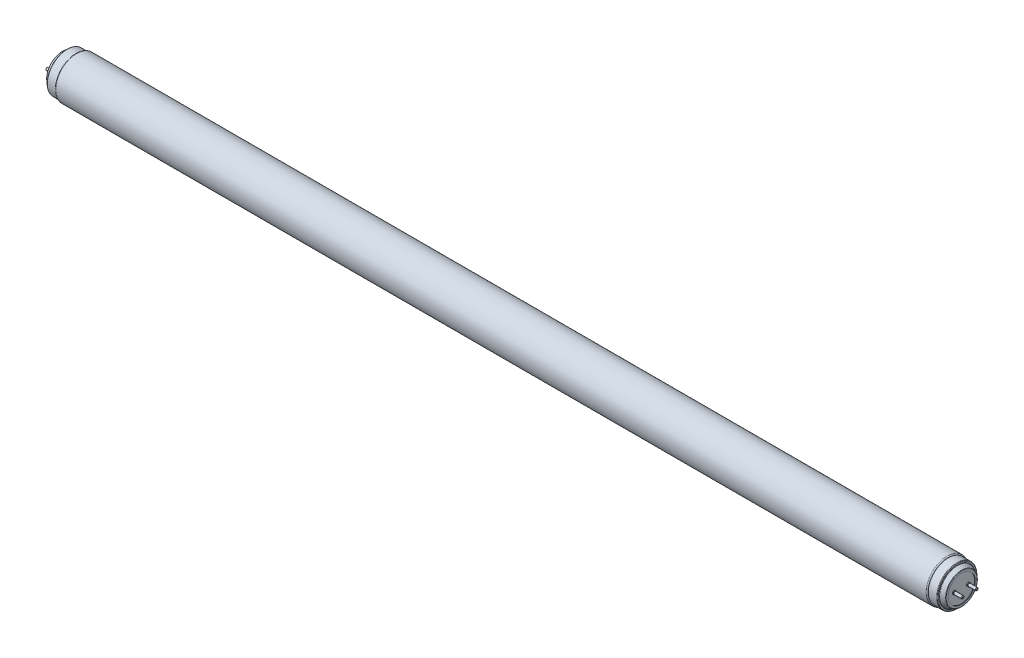
ISO-10303-21;
HEADER;
FILE_DESCRIPTION(('STEP AP214'),'2;1');
FILE_NAME('part.step','',(''),(''),'','','');
FILE_SCHEMA(('AUTOMOTIVE_DESIGN { 1 0 10303 214 1 1 1 1 }'));
ENDSEC;
DATA;
#1=APPLICATION_CONTEXT('core data for automotive mechanical design processes');
#2=APPLICATION_PROTOCOL_DEFINITION('international standard','automotive_design',2000,#1);
#3=PRODUCT_CONTEXT('',#1,'mechanical');
#4=PRODUCT('Part','Part','',(#3));
#5=PRODUCT_RELATED_PRODUCT_CATEGORY('part','',(#4));
#6=PRODUCT_DEFINITION_FORMATION('','',#4);
#7=PRODUCT_DEFINITION_CONTEXT('part definition',#1,'design');
#8=PRODUCT_DEFINITION('design','',#6,#7);
#9=PRODUCT_DEFINITION_SHAPE('','',#8);
#10=(LENGTH_UNIT() NAMED_UNIT(*) SI_UNIT(.MILLI.,.METRE.));
#11=(NAMED_UNIT(*) PLANE_ANGLE_UNIT() SI_UNIT($,.RADIAN.));
#12=(NAMED_UNIT(*) SI_UNIT($,.STERADIAN.) SOLID_ANGLE_UNIT());
#13=UNCERTAINTY_MEASURE_WITH_UNIT(LENGTH_MEASURE(1.E-05),#10,'distance_accuracy_value','');
#14=(GEOMETRIC_REPRESENTATION_CONTEXT(3) GLOBAL_UNCERTAINTY_ASSIGNED_CONTEXT((#13)) GLOBAL_UNIT_ASSIGNED_CONTEXT((#10,
#11,#12)) REPRESENTATION_CONTEXT('',''));
#15=CARTESIAN_POINT('',(0.,0.,0.));
#16=DIRECTION('',(0.,0.,1.));
#17=DIRECTION('',(1.,0.,0.));
#18=AXIS2_PLACEMENT_3D('',#15,#16,#17);
#19=CARTESIAN_POINT('',(787.5,-12.,0.));
#20=DIRECTION('',(-1.,0.,0.));
#21=DIRECTION('',(0.,0.,1.));
#22=AXIS2_PLACEMENT_3D('',#19,#20,#21);
#23=PLANE('',#22);
#24=CARTESIAN_POINT('',(787.5,0.,-6.3));
#25=DIRECTION('',(-1.,0.,0.));
#26=DIRECTION('',(0.,0.,1.));
#27=AXIS2_PLACEMENT_3D('',#24,#25,#26);
#28=CIRCLE('',#27,1.5);
#29=CARTESIAN_POINT('',(787.5,0.,-4.8));
#30=VERTEX_POINT('',#29);
#31=EDGE_CURVE('E77',#30,#30,#28,.F.);
#32=ORIENTED_EDGE('',*,*,#31,.F.);
#33=EDGE_LOOP('',(#32));
#34=FACE_BOUND('',#33,.T.);
#35=CARTESIAN_POINT('',(787.5,0.,0.));
#36=DIRECTION('',(1.,0.,0.));
#37=DIRECTION('',(0.,0.,-1.));
#38=AXIS2_PLACEMENT_3D('',#35,#36,#37);
#39=CIRCLE('',#38,12.);
#40=CARTESIAN_POINT('',(787.5,0.,-12.));
#41=VERTEX_POINT('',#40);
#42=EDGE_CURVE('E99',#41,#41,#39,.T.);
#43=ORIENTED_EDGE('',*,*,#42,.T.);
#44=EDGE_LOOP('',(#43));
#45=FACE_BOUND('',#44,.T.);
#46=CARTESIAN_POINT('',(787.5,0.,6.3));
#47=DIRECTION('',(-1.,0.,0.));
#48=DIRECTION('',(0.,0.,1.));
#49=AXIS2_PLACEMENT_3D('',#46,#47,#48);
#50=CIRCLE('',#49,1.5);
#51=CARTESIAN_POINT('',(787.5,0.,7.8));
#52=VERTEX_POINT('',#51);
#53=EDGE_CURVE('E74',#52,#52,#50,.F.);
#54=ORIENTED_EDGE('',*,*,#53,.F.);
#55=EDGE_LOOP('',(#54));
#56=FACE_BOUND('',#55,.T.);
#57=ADVANCED_FACE('F30',(#34,#45,#56),#23,.F.);
#58=CARTESIAN_POINT('',(-11.5,-12.,0.));
#59=DIRECTION('',(1.,0.,0.));
#60=DIRECTION('',(0.,0.,-1.));
#61=AXIS2_PLACEMENT_3D('',#58,#59,#60);
#62=PLANE('',#61);
#63=CARTESIAN_POINT('',(-11.5,0.,-6.3));
#64=DIRECTION('',(1.,0.,0.));
#65=DIRECTION('',(0.,0.,-1.));
#66=AXIS2_PLACEMENT_3D('',#63,#64,#65);
#67=CIRCLE('',#66,1.5);
#68=CARTESIAN_POINT('',(-11.5,0.,-7.8));
#69=VERTEX_POINT('',#68);
#70=EDGE_CURVE('E90',#69,#69,#67,.F.);
#71=ORIENTED_EDGE('',*,*,#70,.F.);
#72=EDGE_LOOP('',(#71));
#73=FACE_BOUND('',#72,.T.);
#74=CARTESIAN_POINT('',(-11.5,0.,0.));
#75=DIRECTION('',(1.,0.,0.));
#76=DIRECTION('',(0.,0.,-1.));
#77=AXIS2_PLACEMENT_3D('',#74,#75,#76);
#78=CIRCLE('',#77,12.);
#79=CARTESIAN_POINT('',(-11.5,0.,-12.));
#80=VERTEX_POINT('',#79);
#81=EDGE_CURVE('E96',#80,#80,#78,.T.);
#82=ORIENTED_EDGE('',*,*,#81,.F.);
#83=EDGE_LOOP('',(#82));
#84=FACE_BOUND('',#83,.T.);
#85=CARTESIAN_POINT('',(-11.5,0.,6.3));
#86=DIRECTION('',(1.,0.,0.));
#87=DIRECTION('',(0.,0.,-1.));
#88=AXIS2_PLACEMENT_3D('',#85,#86,#87);
#89=CIRCLE('',#88,1.5);
#90=CARTESIAN_POINT('',(-11.5,0.,4.8));
#91=VERTEX_POINT('',#90);
#92=EDGE_CURVE('E84',#91,#91,#89,.F.);
#93=ORIENTED_EDGE('',*,*,#92,.F.);
#94=EDGE_LOOP('',(#93));
#95=FACE_BOUND('',#94,.T.);
#96=ADVANCED_FACE('F273',(#73,#84,#95),#62,.F.);
#97=CARTESIAN_POINT('',(-11.5,0.,0.));
#98=DIRECTION('',(1.,0.,0.));
#99=DIRECTION('',(0.,0.,-1.));
#100=AXIS2_PLACEMENT_3D('',#97,#98,#99);
#101=CYLINDRICAL_SURFACE('',#100,12.);
#102=CARTESIAN_POINT('',(-12.,0.,0.));
#103=DIRECTION('',(1.,0.,0.));
#104=DIRECTION('',(0.,0.,-1.));
#105=AXIS2_PLACEMENT_3D('',#102,#103,#104);
#106=CIRCLE('',#105,12.);
#107=CARTESIAN_POINT('',(-12.,0.,-12.));
#108=VERTEX_POINT('',#107);
#109=EDGE_CURVE('E102',#108,#108,#106,.T.);
#110=ORIENTED_EDGE('',*,*,#109,.F.);
#111=EDGE_LOOP('',(#110));
#112=FACE_BOUND('',#111,.T.);
#113=ORIENTED_EDGE('',*,*,#81,.T.);
#114=EDGE_LOOP('',(#113));
#115=FACE_BOUND('',#114,.T.);
#116=ADVANCED_FACE('F267',(#112,#115),#101,.F.);
#117=CARTESIAN_POINT('',(-12.,-13.6909830056251,0.));
#118=DIRECTION('',(1.,0.,0.));
#119=DIRECTION('',(0.,0.,-1.));
#120=AXIS2_PLACEMENT_3D('',#117,#118,#119);
#121=PLANE('',#120);
#122=CARTESIAN_POINT('',(-12.,0.,0.));
#123=DIRECTION('',(1.,0.,0.));
#124=DIRECTION('',(0.,0.,-1.));
#125=AXIS2_PLACEMENT_3D('',#122,#123,#124);
#126=CIRCLE('',#125,13.6909830056251);
#127=CARTESIAN_POINT('',(-12.,0.,-13.6909830056251));
#128=VERTEX_POINT('',#127);
#129=EDGE_CURVE('E105',#128,#128,#126,.T.);
#130=ORIENTED_EDGE('',*,*,#129,.F.);
#131=EDGE_LOOP('',(#130));
#132=FACE_BOUND('',#131,.T.);
#133=ORIENTED_EDGE('',*,*,#109,.T.);
#134=EDGE_LOOP('',(#133));
#135=FACE_BOUND('',#134,.T.);
#136=ADVANCED_FACE('F261',(#132,#135),#121,.F.);
#137=CARTESIAN_POINT('',(-11.5,0.,0.));
#138=DIRECTION('',(1.,0.,0.));
#139=DIRECTION('',(0.,0.,-1.));
#140=AXIS2_PLACEMENT_3D('',#137,#138,#139);
#141=TOROIDAL_SURFACE('',#140,13.6909830056251,0.5);
#142=CARTESIAN_POINT('',(-11.72360679775,0.,0.));
#143=DIRECTION('',(1.,0.,0.));
#144=DIRECTION('',(0.,0.,-1.));
#145=AXIS2_PLACEMENT_3D('',#142,#143,#144);
#146=CIRCLE('',#145,14.138196601125);
#147=CARTESIAN_POINT('',(-11.72360679775,0.,-14.138196601125));
#148=VERTEX_POINT('',#147);
#149=EDGE_CURVE('E108',#148,#148,#146,.T.);
#150=ORIENTED_EDGE('',*,*,#149,.F.);
#151=EDGE_LOOP('',(#150));
#152=FACE_BOUND('',#151,.T.);
#153=ORIENTED_EDGE('',*,*,#129,.T.);
#154=EDGE_LOOP('',(#153));
#155=FACE_BOUND('',#154,.T.);
#156=ADVANCED_FACE('F255',(#152,#155),#141,.T.);
#157=CARTESIAN_POINT('',(-11.72360679775,0.,0.));
#158=DIRECTION('',(1.,0.,0.));
#159=DIRECTION('',(0.,0.,-1.));
#160=AXIS2_PLACEMENT_3D('',#157,#158,#159);
#161=CONICAL_SURFACE('',#160,14.138196601125,0.463647609000806);
#162=CARTESIAN_POINT('',(-8.27639320225002,0.,0.));
#163=DIRECTION('',(1.,0.,0.));
#164=DIRECTION('',(0.,0.,-1.));
#165=AXIS2_PLACEMENT_3D('',#162,#163,#164);
#166=CIRCLE('',#165,15.861803398875);
#167=CARTESIAN_POINT('',(-8.27639320225002,0.,-15.861803398875));
#168=VERTEX_POINT('',#167);
#169=EDGE_CURVE('E111',#168,#168,#166,.T.);
#170=ORIENTED_EDGE('',*,*,#169,.F.);
#171=EDGE_LOOP('',(#170));
#172=FACE_BOUND('',#171,.T.);
#173=ORIENTED_EDGE('',*,*,#149,.T.);
#174=EDGE_LOOP('',(#173));
#175=FACE_BOUND('',#174,.T.);
#176=ADVANCED_FACE('F249',(#172,#175),#161,.T.);
#177=CARTESIAN_POINT('',(-8.5,0.,0.));
#178=DIRECTION('',(1.,0.,0.));
#179=DIRECTION('',(0.,0.,-1.));
#180=AXIS2_PLACEMENT_3D('',#177,#178,#179);
#181=TOROIDAL_SURFACE('',#180,16.309016994375,0.500000000000001);
#182=CARTESIAN_POINT('',(-8.,0.,0.));
#183=DIRECTION('',(1.,0.,0.));
#184=DIRECTION('',(0.,0.,-1.));
#185=AXIS2_PLACEMENT_3D('',#182,#183,#184);
#186=CIRCLE('',#185,16.309016994375);
#187=CARTESIAN_POINT('',(-8.,0.,-16.309016994375));
#188=VERTEX_POINT('',#187);
#189=EDGE_CURVE('E114',#188,#188,#186,.T.);
#190=ORIENTED_EDGE('',*,*,#189,.F.);
#191=EDGE_LOOP('',(#190));
#192=FACE_BOUND('',#191,.T.);
#193=ORIENTED_EDGE('',*,*,#169,.T.);
#194=EDGE_LOOP('',(#193));
#195=FACE_BOUND('',#194,.T.);
#196=ADVANCED_FACE('F243',(#192,#195),#181,.F.);
#197=CARTESIAN_POINT('',(-8.,-17.25,0.));
#198=DIRECTION('',(1.,0.,0.));
#199=DIRECTION('',(0.,0.,-1.));
#200=AXIS2_PLACEMENT_3D('',#197,#198,#199);
#201=PLANE('',#200);
#202=CARTESIAN_POINT('',(-8.,0.,0.));
#203=DIRECTION('',(1.,0.,0.));
#204=DIRECTION('',(0.,0.,-1.));
#205=AXIS2_PLACEMENT_3D('',#202,#203,#204);
#206=CIRCLE('',#205,17.25);
#207=CARTESIAN_POINT('',(-8.,0.,-17.25));
#208=VERTEX_POINT('',#207);
#209=EDGE_CURVE('E117',#208,#208,#206,.T.);
#210=ORIENTED_EDGE('',*,*,#209,.F.);
#211=EDGE_LOOP('',(#210));
#212=FACE_BOUND('',#211,.T.);
#213=ORIENTED_EDGE('',*,*,#189,.T.);
#214=EDGE_LOOP('',(#213));
#215=FACE_BOUND('',#214,.T.);
#216=ADVANCED_FACE('F237',(#212,#215),#201,.F.);
#217=CARTESIAN_POINT('',(-7.5,0.,0.));
#218=DIRECTION('',(1.,0.,0.));
#219=DIRECTION('',(0.,0.,-1.));
#220=AXIS2_PLACEMENT_3D('',#217,#218,#219);
#221=TOROIDAL_SURFACE('',#220,17.25,0.5);
#222=CARTESIAN_POINT('',(-7.49999999999999,0.,0.));
#223=DIRECTION('',(1.,0.,0.));
#224=DIRECTION('',(0.,0.,-1.));
#225=AXIS2_PLACEMENT_3D('',#222,#223,#224);
#226=CIRCLE('',#225,17.75);
#227=CARTESIAN_POINT('',(-7.49999999999999,0.,-17.75));
#228=VERTEX_POINT('',#227);
#229=EDGE_CURVE('E120',#228,#228,#226,.T.);
#230=ORIENTED_EDGE('',*,*,#229,.F.);
#231=EDGE_LOOP('',(#230));
#232=FACE_BOUND('',#231,.T.);
#233=ORIENTED_EDGE('',*,*,#209,.T.);
#234=EDGE_LOOP('',(#233));
#235=FACE_BOUND('',#234,.T.);
#236=ADVANCED_FACE('F231',(#232,#235),#221,.T.);
#237=CARTESIAN_POINT('',(-11.5,0.,0.));
#238=DIRECTION('',(1.,0.,0.));
#239=DIRECTION('',(0.,0.,-1.));
#240=AXIS2_PLACEMENT_3D('',#237,#238,#239);
#241=CYLINDRICAL_SURFACE('',#240,17.75);
#242=CARTESIAN_POINT('',(0.,0.,0.));
#243=DIRECTION('',(1.,0.,0.));
#244=DIRECTION('',(0.,0.,-1.));
#245=AXIS2_PLACEMENT_3D('',#242,#243,#244);
#246=CIRCLE('',#245,17.75);
#247=CARTESIAN_POINT('',(0.,0.,-17.75));
#248=VERTEX_POINT('',#247);
#249=EDGE_CURVE('E123',#248,#248,#246,.T.);
#250=ORIENTED_EDGE('',*,*,#249,.F.);
#251=EDGE_LOOP('',(#250));
#252=FACE_BOUND('',#251,.T.);
#253=ORIENTED_EDGE('',*,*,#229,.T.);
#254=EDGE_LOOP('',(#253));
#255=FACE_BOUND('',#254,.T.);
#256=ADVANCED_FACE('F225',(#252,#255),#241,.T.);
#257=CARTESIAN_POINT('',(0.950000000000002,0.,0.));
#258=DIRECTION('',(1.,0.,0.));
#259=DIRECTION('',(0.,0.,-1.));
#260=AXIS2_PLACEMENT_3D('',#257,#258,#259);
#261=TOROIDAL_SURFACE('',#260,17.75,0.950000000000001);
#262=CARTESIAN_POINT('',(0.950000000000001,0.,0.));
#263=DIRECTION('',(1.,0.,0.));
#264=DIRECTION('',(0.,0.,-1.));
#265=AXIS2_PLACEMENT_3D('',#262,#263,#264);
#266=CIRCLE('',#265,18.7);
#267=CARTESIAN_POINT('',(0.950000000000001,0.,-18.7));
#268=VERTEX_POINT('',#267);
#269=EDGE_CURVE('E126',#268,#268,#266,.T.);
#270=ORIENTED_EDGE('',*,*,#269,.F.);
#271=EDGE_LOOP('',(#270));
#272=FACE_BOUND('',#271,.T.);
#273=ORIENTED_EDGE('',*,*,#249,.T.);
#274=EDGE_LOOP('',(#273));
#275=FACE_BOUND('',#274,.T.);
#276=ADVANCED_FACE('F219',(#272,#275),#261,.T.);
#277=CARTESIAN_POINT('',(-11.5,0.,0.));
#278=DIRECTION('',(1.,0.,0.));
#279=DIRECTION('',(0.,0.,-1.));
#280=AXIS2_PLACEMENT_3D('',#277,#278,#279);
#281=CYLINDRICAL_SURFACE('',#280,18.7);
#282=CARTESIAN_POINT('',(775.05,0.,0.));
#283=DIRECTION('',(1.,0.,0.));
#284=DIRECTION('',(0.,0.,-1.));
#285=AXIS2_PLACEMENT_3D('',#282,#283,#284);
#286=CIRCLE('',#285,18.7);
#287=CARTESIAN_POINT('',(775.05,0.,-18.7));
#288=VERTEX_POINT('',#287);
#289=EDGE_CURVE('E129',#288,#288,#286,.T.);
#290=ORIENTED_EDGE('',*,*,#289,.F.);
#291=EDGE_LOOP('',(#290));
#292=FACE_BOUND('',#291,.T.);
#293=ORIENTED_EDGE('',*,*,#269,.T.);
#294=EDGE_LOOP('',(#293));
#295=FACE_BOUND('',#294,.T.);
#296=ADVANCED_FACE('F213',(#292,#295),#281,.T.);
#297=CARTESIAN_POINT('',(775.05,0.,0.));
#298=DIRECTION('',(1.,0.,0.));
#299=DIRECTION('',(0.,0.,-1.));
#300=AXIS2_PLACEMENT_3D('',#297,#298,#299);
#301=TOROIDAL_SURFACE('',#300,17.75,0.950000000000005);
#302=CARTESIAN_POINT('',(776.,0.,0.));
#303=DIRECTION('',(1.,0.,0.));
#304=DIRECTION('',(0.,0.,-1.));
#305=AXIS2_PLACEMENT_3D('',#302,#303,#304);
#306=CIRCLE('',#305,17.75);
#307=CARTESIAN_POINT('',(776.,0.,-17.75));
#308=VERTEX_POINT('',#307);
#309=EDGE_CURVE('E132',#308,#308,#306,.T.);
#310=ORIENTED_EDGE('',*,*,#309,.F.);
#311=EDGE_LOOP('',(#310));
#312=FACE_BOUND('',#311,.T.);
#313=ORIENTED_EDGE('',*,*,#289,.T.);
#314=EDGE_LOOP('',(#313));
#315=FACE_BOUND('',#314,.T.);
#316=ADVANCED_FACE('F207',(#312,#315),#301,.T.);
#317=CARTESIAN_POINT('',(-11.5,0.,0.));
#318=DIRECTION('',(1.,0.,0.));
#319=DIRECTION('',(0.,0.,-1.));
#320=AXIS2_PLACEMENT_3D('',#317,#318,#319);
#321=CYLINDRICAL_SURFACE('',#320,17.75);
#322=CARTESIAN_POINT('',(783.5,0.,0.));
#323=DIRECTION('',(1.,0.,0.));
#324=DIRECTION('',(0.,0.,-1.));
#325=AXIS2_PLACEMENT_3D('',#322,#323,#324);
#326=CIRCLE('',#325,17.75);
#327=CARTESIAN_POINT('',(783.5,0.,-17.75));
#328=VERTEX_POINT('',#327);
#329=EDGE_CURVE('E135',#328,#328,#326,.T.);
#330=ORIENTED_EDGE('',*,*,#329,.F.);
#331=EDGE_LOOP('',(#330));
#332=FACE_BOUND('',#331,.T.);
#333=ORIENTED_EDGE('',*,*,#309,.T.);
#334=EDGE_LOOP('',(#333));
#335=FACE_BOUND('',#334,.T.);
#336=ADVANCED_FACE('F201',(#332,#335),#321,.T.);
#337=CARTESIAN_POINT('',(783.5,0.,0.));
#338=DIRECTION('',(1.,0.,0.));
#339=DIRECTION('',(0.,0.,-1.));
#340=AXIS2_PLACEMENT_3D('',#337,#338,#339);
#341=TOROIDAL_SURFACE('',#340,17.25,0.499999999999974);
#342=CARTESIAN_POINT('',(784.,0.,0.));
#343=DIRECTION('',(1.,0.,0.));
#344=DIRECTION('',(0.,0.,-1.));
#345=AXIS2_PLACEMENT_3D('',#342,#343,#344);
#346=CIRCLE('',#345,17.25);
#347=CARTESIAN_POINT('',(784.,0.,-17.25));
#348=VERTEX_POINT('',#347);
#349=EDGE_CURVE('E138',#348,#348,#346,.T.);
#350=ORIENTED_EDGE('',*,*,#349,.F.);
#351=EDGE_LOOP('',(#350));
#352=FACE_BOUND('',#351,.T.);
#353=ORIENTED_EDGE('',*,*,#329,.T.);
#354=EDGE_LOOP('',(#353));
#355=FACE_BOUND('',#354,.T.);
#356=ADVANCED_FACE('F195',(#352,#355),#341,.T.);
#357=CARTESIAN_POINT('',(784.,-17.25,0.));
#358=DIRECTION('',(-1.,0.,0.));
#359=DIRECTION('',(0.,0.,1.));
#360=AXIS2_PLACEMENT_3D('',#357,#358,#359);
#361=PLANE('',#360);
#362=CARTESIAN_POINT('',(784.,0.,0.));
#363=DIRECTION('',(1.,0.,0.));
#364=DIRECTION('',(0.,0.,-1.));
#365=AXIS2_PLACEMENT_3D('',#362,#363,#364);
#366=CIRCLE('',#365,16.3090169943749);
#367=CARTESIAN_POINT('',(784.,0.,-16.3090169943749));
#368=VERTEX_POINT('',#367);
#369=EDGE_CURVE('E141',#368,#368,#366,.T.);
#370=ORIENTED_EDGE('',*,*,#369,.F.);
#371=EDGE_LOOP('',(#370));
#372=FACE_BOUND('',#371,.T.);
#373=ORIENTED_EDGE('',*,*,#349,.T.);
#374=EDGE_LOOP('',(#373));
#375=FACE_BOUND('',#374,.T.);
#376=ADVANCED_FACE('F189',(#372,#375),#361,.F.);
#377=CARTESIAN_POINT('',(784.5,0.,0.));
#378=DIRECTION('',(1.,0.,0.));
#379=DIRECTION('',(0.,0.,-1.));
#380=AXIS2_PLACEMENT_3D('',#377,#378,#379);
#381=TOROIDAL_SURFACE('',#380,16.3090169943749,0.500000000000037);
#382=CARTESIAN_POINT('',(784.27639320225,0.,0.));
#383=DIRECTION('',(1.,0.,0.));
#384=DIRECTION('',(0.,0.,-1.));
#385=AXIS2_PLACEMENT_3D('',#382,#383,#384);
#386=CIRCLE('',#385,15.861803398875);
#387=CARTESIAN_POINT('',(784.27639320225,0.,-15.861803398875));
#388=VERTEX_POINT('',#387);
#389=EDGE_CURVE('E144',#388,#388,#386,.T.);
#390=ORIENTED_EDGE('',*,*,#389,.F.);
#391=EDGE_LOOP('',(#390));
#392=FACE_BOUND('',#391,.T.);
#393=ORIENTED_EDGE('',*,*,#369,.T.);
#394=EDGE_LOOP('',(#393));
#395=FACE_BOUND('',#394,.T.);
#396=ADVANCED_FACE('F183',(#392,#395),#381,.F.);
#397=CARTESIAN_POINT('',(784.27639320225,0.,0.));
#398=DIRECTION('',(-1.,0.,0.));
#399=DIRECTION('',(0.,0.,1.));
#400=AXIS2_PLACEMENT_3D('',#397,#398,#399);
#401=CONICAL_SURFACE('',#400,15.861803398875,0.463647609000804);
#402=CARTESIAN_POINT('',(787.72360679775,0.,0.));
#403=DIRECTION('',(1.,0.,0.));
#404=DIRECTION('',(0.,0.,-1.));
#405=AXIS2_PLACEMENT_3D('',#402,#403,#404);
#406=CIRCLE('',#405,14.138196601125);
#407=CARTESIAN_POINT('',(787.72360679775,0.,-14.138196601125));
#408=VERTEX_POINT('',#407);
#409=EDGE_CURVE('E147',#408,#408,#406,.T.);
#410=ORIENTED_EDGE('',*,*,#409,.F.);
#411=EDGE_LOOP('',(#410));
#412=FACE_BOUND('',#411,.T.);
#413=ORIENTED_EDGE('',*,*,#389,.T.);
#414=EDGE_LOOP('',(#413));
#415=FACE_BOUND('',#414,.T.);
#416=ADVANCED_FACE('F177',(#412,#415),#401,.T.);
#417=CARTESIAN_POINT('',(787.5,0.,0.));
#418=DIRECTION('',(1.,0.,0.));
#419=DIRECTION('',(0.,0.,-1.));
#420=AXIS2_PLACEMENT_3D('',#417,#418,#419);
#421=TOROIDAL_SURFACE('',#420,13.6909830056251,0.499999999999957);
#422=CARTESIAN_POINT('',(788.,0.,0.));
#423=DIRECTION('',(1.,0.,0.));
#424=DIRECTION('',(0.,0.,-1.));
#425=AXIS2_PLACEMENT_3D('',#422,#423,#424);
#426=CIRCLE('',#425,13.6909830056251);
#427=CARTESIAN_POINT('',(788.,0.,-13.6909830056251));
#428=VERTEX_POINT('',#427);
#429=EDGE_CURVE('E150',#428,#428,#426,.T.);
#430=ORIENTED_EDGE('',*,*,#429,.F.);
#431=EDGE_LOOP('',(#430));
#432=FACE_BOUND('',#431,.T.);
#433=ORIENTED_EDGE('',*,*,#409,.T.);
#434=EDGE_LOOP('',(#433));
#435=FACE_BOUND('',#434,.T.);
#436=ADVANCED_FACE('F171',(#432,#435),#421,.T.);
#437=CARTESIAN_POINT('',(788.,-13.6909830056251,0.));
#438=DIRECTION('',(-1.,0.,0.));
#439=DIRECTION('',(0.,0.,1.));
#440=AXIS2_PLACEMENT_3D('',#437,#438,#439);
#441=PLANE('',#440);
#442=CARTESIAN_POINT('',(788.,0.,0.));
#443=DIRECTION('',(1.,0.,0.));
#444=DIRECTION('',(0.,0.,-1.));
#445=AXIS2_PLACEMENT_3D('',#442,#443,#444);
#446=CIRCLE('',#445,12.);
#447=CARTESIAN_POINT('',(788.,0.,-12.));
#448=VERTEX_POINT('',#447);
#449=EDGE_CURVE('E153',#448,#448,#446,.T.);
#450=ORIENTED_EDGE('',*,*,#449,.F.);
#451=EDGE_LOOP('',(#450));
#452=FACE_BOUND('',#451,.T.);
#453=ORIENTED_EDGE('',*,*,#429,.T.);
#454=EDGE_LOOP('',(#453));
#455=FACE_BOUND('',#454,.T.);
#456=ADVANCED_FACE('F165',(#452,#455),#441,.F.);
#457=CARTESIAN_POINT('',(-11.5,0.,0.));
#458=DIRECTION('',(1.,0.,0.));
#459=DIRECTION('',(0.,0.,-1.));
#460=AXIS2_PLACEMENT_3D('',#457,#458,#459);
#461=CYLINDRICAL_SURFACE('',#460,12.);
#462=ORIENTED_EDGE('',*,*,#42,.F.);
#463=EDGE_LOOP('',(#462));
#464=FACE_BOUND('',#463,.T.);
#465=ORIENTED_EDGE('',*,*,#449,.T.);
#466=EDGE_LOOP('',(#465));
#467=FACE_BOUND('',#466,.T.);
#468=ADVANCED_FACE('F161',(#464,#467),#461,.F.);
#469=CARTESIAN_POINT('',(-12.5,0.,-6.3));
#470=DIRECTION('',(1.,0.,0.));
#471=DIRECTION('',(0.,0.,-1.));
#472=AXIS2_PLACEMENT_3D('',#469,#470,#471);
#473=CYLINDRICAL_SURFACE('',#472,1.5);
#474=CARTESIAN_POINT('',(-12.2000000000002,0.,-6.3));
#475=DIRECTION('',(-1.,0.,0.));
#476=DIRECTION('',(0.,0.,1.));
#477=AXIS2_PLACEMENT_3D('',#474,#475,#476);
#478=CIRCLE('',#477,1.5);
#479=CARTESIAN_POINT('',(-12.2000000000002,0.,-4.8));
#480=VERTEX_POINT('',#479);
#481=EDGE_CURVE('E62',#480,#480,#478,.F.);
#482=ORIENTED_EDGE('',*,*,#481,.T.);
#483=EDGE_LOOP('',(#482));
#484=FACE_BOUND('',#483,.T.);
#485=ORIENTED_EDGE('',*,*,#70,.T.);
#486=EDGE_LOOP('',(#485));
#487=FACE_BOUND('',#486,.T.);
#488=ADVANCED_FACE('F164',(#484,#487),#473,.T.);
#489=CARTESIAN_POINT('',(-19.5,0.,-6.3));
#490=DIRECTION('',(-1.,0.,0.));
#491=DIRECTION('',(0.,0.,1.));
#492=AXIS2_PLACEMENT_3D('',#489,#490,#491);
#493=PLANE('',#492);
#494=CARTESIAN_POINT('',(-19.5,0.,-6.3));
#495=DIRECTION('',(-1.,0.,0.));
#496=DIRECTION('',(0.,0.,1.));
#497=AXIS2_PLACEMENT_3D('',#494,#495,#496);
#498=CIRCLE('',#497,0.700000000000034);
#499=CARTESIAN_POINT('',(-19.5,0.,-5.59999999999997));
#500=VERTEX_POINT('',#499);
#501=EDGE_CURVE('E37',#500,#500,#498,.T.);
#502=ORIENTED_EDGE('',*,*,#501,.T.);
#503=EDGE_LOOP('',(#502));
#504=FACE_BOUND('',#503,.T.);
#505=ADVANCED_FACE('F296',(#504),#493,.T.);
#506=CARTESIAN_POINT('',(-19.5,0.,-6.3));
#507=DIRECTION('',(1.,0.,0.));
#508=DIRECTION('',(0.,0.,-1.));
#509=AXIS2_PLACEMENT_3D('',#506,#507,#508);
#510=CYLINDRICAL_SURFACE('',#509,1.2);
#511=CARTESIAN_POINT('',(-19.,0.,-6.3));
#512=DIRECTION('',(-1.,0.,0.));
#513=DIRECTION('',(0.,0.,1.));
#514=AXIS2_PLACEMENT_3D('',#511,#512,#513);
#515=CIRCLE('',#514,1.2);
#516=CARTESIAN_POINT('',(-19.,0.,-5.1));
#517=VERTEX_POINT('',#516);
#518=EDGE_CURVE('E10',#517,#517,#515,.F.);
#519=ORIENTED_EDGE('',*,*,#518,.T.);
#520=EDGE_LOOP('',(#519));
#521=FACE_BOUND('',#520,.T.);
#522=CARTESIAN_POINT('',(-12.5,0.,-6.3));
#523=DIRECTION('',(-1.,0.,0.));
#524=DIRECTION('',(0.,0.,1.));
#525=AXIS2_PLACEMENT_3D('',#522,#523,#524);
#526=CIRCLE('',#525,1.2);
#527=CARTESIAN_POINT('',(-12.5,0.,-5.1));
#528=VERTEX_POINT('',#527);
#529=EDGE_CURVE('E93',#528,#528,#526,.T.);
#530=ORIENTED_EDGE('',*,*,#529,.T.);
#531=EDGE_LOOP('',(#530));
#532=FACE_BOUND('',#531,.T.);
#533=ADVANCED_FACE('F286',(#521,#532),#510,.T.);
#534=CARTESIAN_POINT('',(-12.5,0.,6.3));
#535=DIRECTION('',(1.,0.,0.));
#536=DIRECTION('',(0.,0.,-1.));
#537=AXIS2_PLACEMENT_3D('',#534,#535,#536);
#538=CYLINDRICAL_SURFACE('',#537,1.5);
#539=CARTESIAN_POINT('',(-12.1999999999999,0.,6.3));
#540=DIRECTION('',(-1.,0.,0.));
#541=DIRECTION('',(0.,0.,1.));
#542=AXIS2_PLACEMENT_3D('',#539,#540,#541);
#543=CIRCLE('',#542,1.5);
#544=CARTESIAN_POINT('',(-12.1999999999999,0.,7.8));
#545=VERTEX_POINT('',#544);
#546=EDGE_CURVE('E65',#545,#545,#543,.F.);
#547=ORIENTED_EDGE('',*,*,#546,.T.);
#548=EDGE_LOOP('',(#547));
#549=FACE_BOUND('',#548,.T.);
#550=ORIENTED_EDGE('',*,*,#92,.T.);
#551=EDGE_LOOP('',(#550));
#552=FACE_BOUND('',#551,.T.);
#553=ADVANCED_FACE('F283',(#549,#552),#538,.T.);
#554=CARTESIAN_POINT('',(-19.5,0.,6.3));
#555=DIRECTION('',(-1.,0.,0.));
#556=DIRECTION('',(0.,0.,1.));
#557=AXIS2_PLACEMENT_3D('',#554,#555,#556);
#558=PLANE('',#557);
#559=CARTESIAN_POINT('',(-19.5,0.,6.3));
#560=DIRECTION('',(-1.,0.,0.));
#561=DIRECTION('',(0.,0.,1.));
#562=AXIS2_PLACEMENT_3D('',#559,#560,#561);
#563=CIRCLE('',#562,0.700000000000034);
#564=CARTESIAN_POINT('',(-19.5,0.,7.00000000000003));
#565=VERTEX_POINT('',#564);
#566=EDGE_CURVE('E45',#565,#565,#563,.T.);
#567=ORIENTED_EDGE('',*,*,#566,.T.);
#568=EDGE_LOOP('',(#567));
#569=FACE_BOUND('',#568,.T.);
#570=ADVANCED_FACE('F285',(#569),#558,.T.);
#571=CARTESIAN_POINT('',(-19.5,0.,6.3));
#572=DIRECTION('',(1.,0.,0.));
#573=DIRECTION('',(0.,0.,-1.));
#574=AXIS2_PLACEMENT_3D('',#571,#572,#573);
#575=CYLINDRICAL_SURFACE('',#574,1.2);
#576=CARTESIAN_POINT('',(-19.,0.,6.3));
#577=DIRECTION('',(-1.,0.,0.));
#578=DIRECTION('',(0.,0.,1.));
#579=AXIS2_PLACEMENT_3D('',#576,#577,#578);
#580=CIRCLE('',#579,1.2);
#581=CARTESIAN_POINT('',(-19.,0.,7.5));
#582=VERTEX_POINT('',#581);
#583=EDGE_CURVE('E41',#582,#582,#580,.F.);
#584=ORIENTED_EDGE('',*,*,#583,.T.);
#585=EDGE_LOOP('',(#584));
#586=FACE_BOUND('',#585,.T.);
#587=CARTESIAN_POINT('',(-12.5,0.,6.3));
#588=DIRECTION('',(-1.,0.,0.));
#589=DIRECTION('',(0.,0.,1.));
#590=AXIS2_PLACEMENT_3D('',#587,#588,#589);
#591=CIRCLE('',#590,1.2);
#592=CARTESIAN_POINT('',(-12.5,0.,7.5));
#593=VERTEX_POINT('',#592);
#594=EDGE_CURVE('E87',#593,#593,#591,.T.);
#595=ORIENTED_EDGE('',*,*,#594,.T.);
#596=EDGE_LOOP('',(#595));
#597=FACE_BOUND('',#596,.T.);
#598=ADVANCED_FACE('F293',(#586,#597),#575,.T.);
#599=CARTESIAN_POINT('',(788.5,0.,-6.3));
#600=DIRECTION('',(-1.,0.,0.));
#601=DIRECTION('',(0.,0.,1.));
#602=AXIS2_PLACEMENT_3D('',#599,#600,#601);
#603=CYLINDRICAL_SURFACE('',#602,1.5);
#604=CARTESIAN_POINT('',(788.2,0.,-6.3));
#605=DIRECTION('',(1.,0.,0.));
#606=DIRECTION('',(0.,0.,-1.));
#607=AXIS2_PLACEMENT_3D('',#604,#605,#606);
#608=CIRCLE('',#607,1.5);
#609=CARTESIAN_POINT('',(788.2,0.,-7.8));
#610=VERTEX_POINT('',#609);
#611=EDGE_CURVE('E71',#610,#610,#608,.F.);
#612=ORIENTED_EDGE('',*,*,#611,.T.);
#613=EDGE_LOOP('',(#612));
#614=FACE_BOUND('',#613,.T.);
#615=ORIENTED_EDGE('',*,*,#31,.T.);
#616=EDGE_LOOP('',(#615));
#617=FACE_BOUND('',#616,.T.);
#618=ADVANCED_FACE('F345',(#614,#617),#603,.T.);
#619=CARTESIAN_POINT('',(795.5,0.,-6.3));
#620=DIRECTION('',(1.,0.,0.));
#621=DIRECTION('',(0.,0.,-1.));
#622=AXIS2_PLACEMENT_3D('',#619,#620,#621);
#623=PLANE('',#622);
#624=CARTESIAN_POINT('',(795.5,0.,-6.3));
#625=DIRECTION('',(1.,0.,0.));
#626=DIRECTION('',(0.,0.,-1.));
#627=AXIS2_PLACEMENT_3D('',#624,#625,#626);
#628=CIRCLE('',#627,0.700000000000034);
#629=CARTESIAN_POINT('',(795.5,0.,-7.00000000000003));
#630=VERTEX_POINT('',#629);
#631=EDGE_CURVE('E59',#630,#630,#628,.T.);
#632=ORIENTED_EDGE('',*,*,#631,.T.);
#633=EDGE_LOOP('',(#632));
#634=FACE_BOUND('',#633,.T.);
#635=ADVANCED_FACE('F352',(#634),#623,.T.);
#636=CARTESIAN_POINT('',(795.5,0.,-6.3));
#637=DIRECTION('',(-1.,0.,0.));
#638=DIRECTION('',(0.,0.,1.));
#639=AXIS2_PLACEMENT_3D('',#636,#637,#638);
#640=CYLINDRICAL_SURFACE('',#639,1.2);
#641=CARTESIAN_POINT('',(795.,0.,-6.3));
#642=DIRECTION('',(1.,0.,0.));
#643=DIRECTION('',(0.,0.,-1.));
#644=AXIS2_PLACEMENT_3D('',#641,#642,#643);
#645=CIRCLE('',#644,1.2);
#646=CARTESIAN_POINT('',(795.,0.,-7.5));
#647=VERTEX_POINT('',#646);
#648=EDGE_CURVE('E56',#647,#647,#645,.F.);
#649=ORIENTED_EDGE('',*,*,#648,.T.);
#650=EDGE_LOOP('',(#649));
#651=FACE_BOUND('',#650,.T.);
#652=CARTESIAN_POINT('',(788.5,0.,-6.3));
#653=DIRECTION('',(1.,0.,0.));
#654=DIRECTION('',(0.,0.,-1.));
#655=AXIS2_PLACEMENT_3D('',#652,#653,#654);
#656=CIRCLE('',#655,1.2);
#657=CARTESIAN_POINT('',(788.5,0.,-7.5));
#658=VERTEX_POINT('',#657);
#659=EDGE_CURVE('E81',#658,#658,#656,.T.);
#660=ORIENTED_EDGE('',*,*,#659,.T.);
#661=EDGE_LOOP('',(#660));
#662=FACE_BOUND('',#661,.T.);
#663=ADVANCED_FACE('F472',(#651,#662),#640,.T.);
#664=CARTESIAN_POINT('',(788.5,0.,6.3));
#665=DIRECTION('',(-1.,0.,0.));
#666=DIRECTION('',(0.,0.,1.));
#667=AXIS2_PLACEMENT_3D('',#664,#665,#666);
#668=CYLINDRICAL_SURFACE('',#667,1.5);
#669=CARTESIAN_POINT('',(788.2,0.,6.3));
#670=DIRECTION('',(1.,0.,0.));
#671=DIRECTION('',(0.,0.,-1.));
#672=AXIS2_PLACEMENT_3D('',#669,#670,#671);
#673=CIRCLE('',#672,1.5);
#674=CARTESIAN_POINT('',(788.2,0.,4.8));
#675=VERTEX_POINT('',#674);
#676=EDGE_CURVE('E68',#675,#675,#673,.F.);
#677=ORIENTED_EDGE('',*,*,#676,.T.);
#678=EDGE_LOOP('',(#677));
#679=FACE_BOUND('',#678,.T.);
#680=ORIENTED_EDGE('',*,*,#53,.T.);
#681=EDGE_LOOP('',(#680));
#682=FACE_BOUND('',#681,.T.);
#683=ADVANCED_FACE('F467',(#679,#682),#668,.T.);
#684=CARTESIAN_POINT('',(795.5,0.,6.3));
#685=DIRECTION('',(1.,0.,0.));
#686=DIRECTION('',(0.,0.,-1.));
#687=AXIS2_PLACEMENT_3D('',#684,#685,#686);
#688=PLANE('',#687);
#689=CARTESIAN_POINT('',(795.5,0.,6.3));
#690=DIRECTION('',(1.,0.,0.));
#691=DIRECTION('',(0.,0.,-1.));
#692=AXIS2_PLACEMENT_3D('',#689,#690,#691);
#693=CIRCLE('',#692,0.700000000000034);
#694=CARTESIAN_POINT('',(795.5,0.,5.59999999999997));
#695=VERTEX_POINT('',#694);
#696=EDGE_CURVE('E53',#695,#695,#693,.T.);
#697=ORIENTED_EDGE('',*,*,#696,.T.);
#698=EDGE_LOOP('',(#697));
#699=FACE_BOUND('',#698,.T.);
#700=ADVANCED_FACE('F456',(#699),#688,.T.);
#701=CARTESIAN_POINT('',(795.5,0.,6.3));
#702=DIRECTION('',(-1.,0.,0.));
#703=DIRECTION('',(0.,0.,1.));
#704=AXIS2_PLACEMENT_3D('',#701,#702,#703);
#705=CYLINDRICAL_SURFACE('',#704,1.2);
#706=CARTESIAN_POINT('',(795.,0.,6.3));
#707=DIRECTION('',(1.,0.,0.));
#708=DIRECTION('',(0.,0.,-1.));
#709=AXIS2_PLACEMENT_3D('',#706,#707,#708);
#710=CIRCLE('',#709,1.2);
#711=CARTESIAN_POINT('',(795.,0.,5.1));
#712=VERTEX_POINT('',#711);
#713=EDGE_CURVE('E50',#712,#712,#710,.F.);
#714=ORIENTED_EDGE('',*,*,#713,.T.);
#715=EDGE_LOOP('',(#714));
#716=FACE_BOUND('',#715,.T.);
#717=CARTESIAN_POINT('',(788.5,0.,6.3));
#718=DIRECTION('',(1.,0.,0.));
#719=DIRECTION('',(0.,0.,-1.));
#720=AXIS2_PLACEMENT_3D('',#717,#718,#719);
#721=CIRCLE('',#720,1.2);
#722=CARTESIAN_POINT('',(788.5,0.,5.1));
#723=VERTEX_POINT('',#722);
#724=EDGE_CURVE('E78',#723,#723,#721,.T.);
#725=ORIENTED_EDGE('',*,*,#724,.T.);
#726=EDGE_LOOP('',(#725));
#727=FACE_BOUND('',#726,.T.);
#728=ADVANCED_FACE('F312',(#716,#727),#705,.T.);
#729=CARTESIAN_POINT('',(788.5,0.,-6.3));
#730=DIRECTION('',(-1.,0.,0.));
#731=DIRECTION('',(0.,0.,1.));
#732=AXIS2_PLACEMENT_3D('',#729,#730,#731);
#733=CONICAL_SURFACE('',#732,1.19999999999998,0.785398163397168);
#734=ORIENTED_EDGE('',*,*,#611,.F.);
#735=EDGE_LOOP('',(#734));
#736=FACE_BOUND('',#735,.T.);
#737=ORIENTED_EDGE('',*,*,#659,.F.);
#738=EDGE_LOOP('',(#737));
#739=FACE_BOUND('',#738,.T.);
#740=ADVANCED_FACE('F308',(#736,#739),#733,.T.);
#741=CARTESIAN_POINT('',(788.5,0.,6.3));
#742=DIRECTION('',(-1.,0.,0.));
#743=DIRECTION('',(0.,0.,1.));
#744=AXIS2_PLACEMENT_3D('',#741,#742,#743);
#745=CONICAL_SURFACE('',#744,1.20000000000031,0.785398163397168);
#746=ORIENTED_EDGE('',*,*,#676,.F.);
#747=EDGE_LOOP('',(#746));
#748=FACE_BOUND('',#747,.T.);
#749=ORIENTED_EDGE('',*,*,#724,.F.);
#750=EDGE_LOOP('',(#749));
#751=FACE_BOUND('',#750,.T.);
#752=ADVANCED_FACE('F311',(#748,#751),#745,.T.);
#753=CARTESIAN_POINT('',(-12.5,0.,6.3));
#754=DIRECTION('',(1.,0.,0.));
#755=DIRECTION('',(0.,0.,-1.));
#756=AXIS2_PLACEMENT_3D('',#753,#754,#755);
#757=CONICAL_SURFACE('',#756,1.19999999999998,0.785398163397257);
#758=ORIENTED_EDGE('',*,*,#546,.F.);
#759=EDGE_LOOP('',(#758));
#760=FACE_BOUND('',#759,.T.);
#761=ORIENTED_EDGE('',*,*,#594,.F.);
#762=EDGE_LOOP('',(#761));
#763=FACE_BOUND('',#762,.T.);
#764=ADVANCED_FACE('F316',(#760,#763),#757,.T.);
#765=CARTESIAN_POINT('',(-12.5,0.,-6.3));
#766=DIRECTION('',(1.,0.,0.));
#767=DIRECTION('',(0.,0.,-1.));
#768=AXIS2_PLACEMENT_3D('',#765,#766,#767);
#769=CONICAL_SURFACE('',#768,1.20000000000031,0.785398163397257);
#770=ORIENTED_EDGE('',*,*,#481,.F.);
#771=EDGE_LOOP('',(#770));
#772=FACE_BOUND('',#771,.T.);
#773=ORIENTED_EDGE('',*,*,#529,.F.);
#774=EDGE_LOOP('',(#773));
#775=FACE_BOUND('',#774,.T.);
#776=ADVANCED_FACE('F320',(#772,#775),#769,.T.);
#777=CARTESIAN_POINT('',(795.5,0.,-6.3));
#778=DIRECTION('',(-1.,0.,0.));
#779=DIRECTION('',(0.,0.,1.));
#780=AXIS2_PLACEMENT_3D('',#777,#778,#779);
#781=CONICAL_SURFACE('',#780,0.700000000000034,0.785398163397469);
#782=ORIENTED_EDGE('',*,*,#648,.F.);
#783=EDGE_LOOP('',(#782));
#784=FACE_BOUND('',#783,.T.);
#785=ORIENTED_EDGE('',*,*,#631,.F.);
#786=EDGE_LOOP('',(#785));
#787=FACE_BOUND('',#786,.T.);
#788=ADVANCED_FACE('F324',(#784,#787),#781,.T.);
#789=CARTESIAN_POINT('',(795.5,0.,6.3));
#790=DIRECTION('',(-1.,0.,0.));
#791=DIRECTION('',(0.,0.,1.));
#792=AXIS2_PLACEMENT_3D('',#789,#790,#791);
#793=CONICAL_SURFACE('',#792,0.700000000000034,0.785398163397469);
#794=ORIENTED_EDGE('',*,*,#713,.F.);
#795=EDGE_LOOP('',(#794));
#796=FACE_BOUND('',#795,.T.);
#797=ORIENTED_EDGE('',*,*,#696,.F.);
#798=EDGE_LOOP('',(#797));
#799=FACE_BOUND('',#798,.T.);
#800=ADVANCED_FACE('F328',(#796,#799),#793,.T.);
#801=CARTESIAN_POINT('',(-19.5,0.,6.3));
#802=DIRECTION('',(1.,0.,0.));
#803=DIRECTION('',(0.,0.,-1.));
#804=AXIS2_PLACEMENT_3D('',#801,#802,#803);
#805=CONICAL_SURFACE('',#804,0.700000000000034,0.785398163397445);
#806=ORIENTED_EDGE('',*,*,#583,.F.);
#807=EDGE_LOOP('',(#806));
#808=FACE_BOUND('',#807,.T.);
#809=ORIENTED_EDGE('',*,*,#566,.F.);
#810=EDGE_LOOP('',(#809));
#811=FACE_BOUND('',#810,.T.);
#812=ADVANCED_FACE('F331',(#808,#811),#805,.T.);
#813=CARTESIAN_POINT('',(-19.5,0.,-6.3));
#814=DIRECTION('',(1.,0.,0.));
#815=DIRECTION('',(0.,0.,-1.));
#816=AXIS2_PLACEMENT_3D('',#813,#814,#815);
#817=CONICAL_SURFACE('',#816,0.700000000000034,0.785398163397445);
#818=ORIENTED_EDGE('',*,*,#518,.F.);
#819=EDGE_LOOP('',(#818));
#820=FACE_BOUND('',#819,.T.);
#821=ORIENTED_EDGE('',*,*,#501,.F.);
#822=EDGE_LOOP('',(#821));
#823=FACE_BOUND('',#822,.T.);
#824=ADVANCED_FACE('F32',(#820,#823),#817,.T.);
#825=CLOSED_SHELL('',(#57,#96,#116,#136,#156,#176,#196,#216,#236,#256,#276,#296,#316,#336,#356,
#376,#396,#416,#436,#456,#468,#488,#505,#533,#553,#570,#598,#618,#635,#663,#683,#700,#728,#740,
#752,#764,#776,#788,#800,#812,#824));
#826=MANIFOLD_SOLID_BREP('B2',#825);
#827=ADVANCED_BREP_SHAPE_REPRESENTATION('',(#18,#826),#14);
#828=SHAPE_DEFINITION_REPRESENTATION(#9,#827);
ENDSEC;
END-ISO-10303-21;
